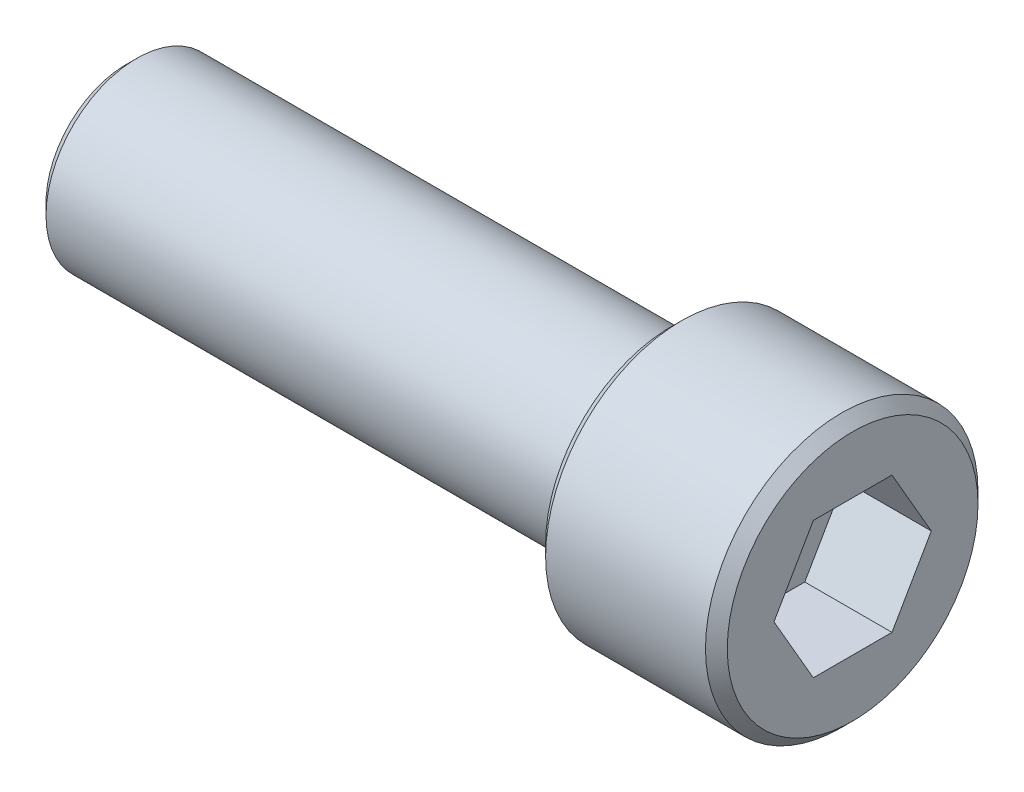
ISO-10303-21;
HEADER;
FILE_DESCRIPTION(('STEP AP214'),'2;1');
FILE_NAME('part.step','',(''),(''),'','','');
FILE_SCHEMA(('AUTOMOTIVE_DESIGN { 1 0 10303 214 1 1 1 1 }'));
ENDSEC;
DATA;
#1=APPLICATION_CONTEXT('core data for automotive mechanical design processes');
#2=APPLICATION_PROTOCOL_DEFINITION('international standard','automotive_design',2000,#1);
#3=PRODUCT_CONTEXT('',#1,'mechanical');
#4=PRODUCT('Part','Part','',(#3));
#5=PRODUCT_RELATED_PRODUCT_CATEGORY('part','',(#4));
#6=PRODUCT_DEFINITION_FORMATION('','',#4);
#7=PRODUCT_DEFINITION_CONTEXT('part definition',#1,'design');
#8=PRODUCT_DEFINITION('design','',#6,#7);
#9=PRODUCT_DEFINITION_SHAPE('','',#8);
#10=(LENGTH_UNIT() NAMED_UNIT(*) SI_UNIT(.MILLI.,.METRE.));
#11=(NAMED_UNIT(*) PLANE_ANGLE_UNIT() SI_UNIT($,.RADIAN.));
#12=(NAMED_UNIT(*) SI_UNIT($,.STERADIAN.) SOLID_ANGLE_UNIT());
#13=UNCERTAINTY_MEASURE_WITH_UNIT(LENGTH_MEASURE(1.E-05),#10,'distance_accuracy_value','');
#14=(GEOMETRIC_REPRESENTATION_CONTEXT(3) GLOBAL_UNCERTAINTY_ASSIGNED_CONTEXT((#13)) GLOBAL_UNIT_ASSIGNED_CONTEXT((#10,
#11,#12)) REPRESENTATION_CONTEXT('',''));
#15=CARTESIAN_POINT('',(0.,0.,0.));
#16=DIRECTION('',(0.,0.,1.));
#17=DIRECTION('',(1.,0.,0.));
#18=AXIS2_PLACEMENT_3D('',#15,#16,#17);
#19=CARTESIAN_POINT('',(0.,3.175,0.));
#20=DIRECTION('',(1.,0.,0.));
#21=DIRECTION('',(0.,0.,-1.));
#22=AXIS2_PLACEMENT_3D('',#19,#20,#21);
#23=PLANE('',#22);
#24=CARTESIAN_POINT('',(0.,0.,0.));
#25=DIRECTION('',(1.,0.,0.));
#26=DIRECTION('',(0.,0.,-1.));
#27=AXIS2_PLACEMENT_3D('',#24,#25,#26);
#28=CIRCLE('',#27,2.794);
#29=CARTESIAN_POINT('',(0.,0.,-2.794));
#30=VERTEX_POINT('',#29);
#31=EDGE_CURVE('E143',#30,#30,#28,.F.);
#32=ORIENTED_EDGE('',*,*,#31,.T.);
#33=EDGE_LOOP('',(#32));
#34=FACE_BOUND('',#33,.T.);
#35=ADVANCED_FACE('F33',(#34),#23,.F.);
#36=CARTESIAN_POINT('',(25.4,0.,0.));
#37=DIRECTION('',(-1.,0.,0.));
#38=DIRECTION('',(0.,0.,1.));
#39=AXIS2_PLACEMENT_3D('',#36,#37,#38);
#40=PLANE('',#39);
#41=CARTESIAN_POINT('',(25.4,0.,0.));
#42=DIRECTION('',(-1.,0.,0.));
#43=DIRECTION('',(0.,0.,1.));
#44=AXIS2_PLACEMENT_3D('',#41,#42,#43);
#45=CIRCLE('',#44,4.3815);
#46=CARTESIAN_POINT('',(25.4,0.,4.3815));
#47=VERTEX_POINT('',#46);
#48=EDGE_CURVE('E11',#47,#47,#45,.F.);
#49=ORIENTED_EDGE('',*,*,#48,.T.);
#50=EDGE_LOOP('',(#49));
#51=FACE_BOUND('',#50,.T.);
#52=DIRECTION('',(0.,-0.866025403784439,0.5));
#53=VECTOR('',#52,1.);
#54=CARTESIAN_POINT('',(25.4,2.38125,1.3748153285078));
#55=LINE('',#54,#53);
#56=CARTESIAN_POINT('',(25.4,2.38125,1.3748153285078));
#57=VERTEX_POINT('',#56);
#58=CARTESIAN_POINT('',(25.4,0.,2.74963065701559));
#59=VERTEX_POINT('',#58);
#60=EDGE_CURVE('E122',#57,#59,#55,.T.);
#61=ORIENTED_EDGE('',*,*,#60,.F.);
#62=DIRECTION('',(0.,0.,1.));
#63=VECTOR('',#62,1.);
#64=CARTESIAN_POINT('',(25.4,2.38125,-1.3748153285078));
#65=LINE('',#64,#63);
#66=CARTESIAN_POINT('',(25.4,2.38125,-1.3748153285078));
#67=VERTEX_POINT('',#66);
#68=EDGE_CURVE('E48',#67,#57,#65,.T.);
#69=ORIENTED_EDGE('',*,*,#68,.F.);
#70=DIRECTION('',(0.,0.866025403784439,0.5));
#71=VECTOR('',#70,1.);
#72=CARTESIAN_POINT('',(25.4,0.,-2.74963065701559));
#73=LINE('',#72,#71);
#74=CARTESIAN_POINT('',(25.4,0.,-2.74963065701559));
#75=VERTEX_POINT('',#74);
#76=EDGE_CURVE('E131',#75,#67,#73,.T.);
#77=ORIENTED_EDGE('',*,*,#76,.F.);
#78=DIRECTION('',(0.,0.866025403784439,-0.5));
#79=VECTOR('',#78,1.);
#80=CARTESIAN_POINT('',(25.4,-2.38125,-1.3748153285078));
#81=LINE('',#80,#79);
#82=CARTESIAN_POINT('',(25.4,-2.38125,-1.3748153285078));
#83=VERTEX_POINT('',#82);
#84=EDGE_CURVE('E129',#83,#75,#81,.T.);
#85=ORIENTED_EDGE('',*,*,#84,.F.);
#86=DIRECTION('',(0.,0.,-1.));
#87=VECTOR('',#86,1.);
#88=CARTESIAN_POINT('',(25.4,-2.38125,1.3748153285078));
#89=LINE('',#88,#87);
#90=CARTESIAN_POINT('',(25.4,-2.38125,1.3748153285078));
#91=VERTEX_POINT('',#90);
#92=EDGE_CURVE('E96',#91,#83,#89,.T.);
#93=ORIENTED_EDGE('',*,*,#92,.F.);
#94=DIRECTION('',(0.,-0.866025403784439,-0.5));
#95=VECTOR('',#94,1.);
#96=CARTESIAN_POINT('',(25.4,0.,2.74963065701559));
#97=LINE('',#96,#95);
#98=EDGE_CURVE('E125',#59,#91,#97,.T.);
#99=ORIENTED_EDGE('',*,*,#98,.F.);
#100=EDGE_LOOP('',(#61,#69,#77,#85,#93,#99));
#101=FACE_BOUND('',#100,.T.);
#102=ADVANCED_FACE('F183',(#51,#101),#40,.F.);
#103=CARTESIAN_POINT('',(0.,0.,0.));
#104=DIRECTION('',(-1.,0.,0.));
#105=DIRECTION('',(0.,0.,1.));
#106=AXIS2_PLACEMENT_3D('',#103,#104,#105);
#107=CYLINDRICAL_SURFACE('',#106,4.7625);
#108=CARTESIAN_POINT('',(19.431,0.,0.));
#109=DIRECTION('',(1.,0.,0.));
#110=DIRECTION('',(0.,0.,-1.));
#111=AXIS2_PLACEMENT_3D('',#108,#109,#110);
#112=CIRCLE('',#111,4.7625);
#113=CARTESIAN_POINT('',(19.431,0.,-4.7625));
#114=VERTEX_POINT('',#113);
#115=EDGE_CURVE('E41',#114,#114,#112,.T.);
#116=ORIENTED_EDGE('',*,*,#115,.T.);
#117=EDGE_LOOP('',(#116));
#118=FACE_BOUND('',#117,.T.);
#119=CARTESIAN_POINT('',(25.019,0.,0.));
#120=DIRECTION('',(-1.,0.,0.));
#121=DIRECTION('',(0.,0.,1.));
#122=AXIS2_PLACEMENT_3D('',#119,#120,#121);
#123=CIRCLE('',#122,4.7625);
#124=CARTESIAN_POINT('',(25.019,0.,4.7625));
#125=VERTEX_POINT('',#124);
#126=EDGE_CURVE('E152',#125,#125,#123,.T.);
#127=ORIENTED_EDGE('',*,*,#126,.T.);
#128=EDGE_LOOP('',(#127));
#129=FACE_BOUND('',#128,.T.);
#130=ADVANCED_FACE('F157',(#118,#129),#107,.T.);
#131=CARTESIAN_POINT('',(19.05,4.7625,0.));
#132=DIRECTION('',(1.,0.,0.));
#133=DIRECTION('',(0.,0.,-1.));
#134=AXIS2_PLACEMENT_3D('',#131,#132,#133);
#135=PLANE('',#134);
#136=CARTESIAN_POINT('',(19.05,0.,0.));
#137=DIRECTION('',(1.,0.,0.));
#138=DIRECTION('',(0.,0.,-1.));
#139=AXIS2_PLACEMENT_3D('',#136,#137,#138);
#140=CIRCLE('',#139,4.3815);
#141=CARTESIAN_POINT('',(19.05,0.,-4.3815));
#142=VERTEX_POINT('',#141);
#143=EDGE_CURVE('E149',#142,#142,#140,.F.);
#144=ORIENTED_EDGE('',*,*,#143,.T.);
#145=EDGE_LOOP('',(#144));
#146=FACE_BOUND('',#145,.T.);
#147=CARTESIAN_POINT('',(19.05,0.,0.));
#148=DIRECTION('',(-1.,0.,0.));
#149=DIRECTION('',(0.,0.,1.));
#150=AXIS2_PLACEMENT_3D('',#147,#148,#149);
#151=CIRCLE('',#150,3.175);
#152=CARTESIAN_POINT('',(19.05,0.,3.175));
#153=VERTEX_POINT('',#152);
#154=EDGE_CURVE('E135',#153,#153,#151,.T.);
#155=ORIENTED_EDGE('',*,*,#154,.F.);
#156=EDGE_LOOP('',(#155));
#157=FACE_BOUND('',#156,.T.);
#158=ADVANCED_FACE('F166',(#146,#157),#135,.F.);
#159=CARTESIAN_POINT('',(0.,0.,0.));
#160=DIRECTION('',(-1.,0.,0.));
#161=DIRECTION('',(0.,0.,1.));
#162=AXIS2_PLACEMENT_3D('',#159,#160,#161);
#163=CYLINDRICAL_SURFACE('',#162,3.175);
#164=CARTESIAN_POINT('',(0.380999999999999,0.,0.));
#165=DIRECTION('',(1.,0.,0.));
#166=DIRECTION('',(0.,0.,-1.));
#167=AXIS2_PLACEMENT_3D('',#164,#165,#166);
#168=CIRCLE('',#167,3.175);
#169=CARTESIAN_POINT('',(0.380999999999999,0.,-3.175));
#170=VERTEX_POINT('',#169);
#171=EDGE_CURVE('E146',#170,#170,#168,.T.);
#172=ORIENTED_EDGE('',*,*,#171,.T.);
#173=EDGE_LOOP('',(#172));
#174=FACE_BOUND('',#173,.T.);
#175=ORIENTED_EDGE('',*,*,#154,.T.);
#176=EDGE_LOOP('',(#175));
#177=FACE_BOUND('',#176,.T.);
#178=ADVANCED_FACE('F169',(#174,#177),#163,.T.);
#179=CARTESIAN_POINT('',(22.352,2.38125,-1.3748153285078));
#180=DIRECTION('',(0.,1.,0.));
#181=DIRECTION('',(0.,0.,1.));
#182=AXIS2_PLACEMENT_3D('',#179,#180,#181);
#183=PLANE('',#182);
#184=ORIENTED_EDGE('',*,*,#68,.T.);
#185=DIRECTION('',(1.,0.,0.));
#186=VECTOR('',#185,1.);
#187=CARTESIAN_POINT('',(22.352,2.38125,1.3748153285078));
#188=LINE('',#187,#186);
#189=CARTESIAN_POINT('',(22.352,2.38125,1.3748153285078));
#190=VERTEX_POINT('',#189);
#191=EDGE_CURVE('E78',#190,#57,#188,.T.);
#192=ORIENTED_EDGE('',*,*,#191,.F.);
#193=DIRECTION('',(0.,0.,1.));
#194=VECTOR('',#193,1.);
#195=CARTESIAN_POINT('',(22.352,2.38125,-1.3748153285078));
#196=LINE('',#195,#194);
#197=CARTESIAN_POINT('',(22.352,2.38125,-1.3748153285078));
#198=VERTEX_POINT('',#197);
#199=EDGE_CURVE('E133',#198,#190,#196,.T.);
#200=ORIENTED_EDGE('',*,*,#199,.F.);
#201=DIRECTION('',(1.,0.,0.));
#202=VECTOR('',#201,1.);
#203=CARTESIAN_POINT('',(22.352,2.38125,-1.3748153285078));
#204=LINE('',#203,#202);
#205=EDGE_CURVE('E56',#198,#67,#204,.T.);
#206=ORIENTED_EDGE('',*,*,#205,.T.);
#207=EDGE_LOOP('',(#184,#192,#200,#206));
#208=FACE_BOUND('',#207,.T.);
#209=ADVANCED_FACE('F174',(#208),#183,.F.);
#210=CARTESIAN_POINT('',(22.352,0.,-2.74963065701559));
#211=DIRECTION('',(0.,0.5,-0.866025403784439));
#212=DIRECTION('',(0.,0.866025403784439,0.5));
#213=AXIS2_PLACEMENT_3D('',#210,#211,#212);
#214=PLANE('',#213);
#215=ORIENTED_EDGE('',*,*,#76,.T.);
#216=ORIENTED_EDGE('',*,*,#205,.F.);
#217=DIRECTION('',(0.,0.866025403784439,0.5));
#218=VECTOR('',#217,1.);
#219=CARTESIAN_POINT('',(22.352,0.,-2.74963065701559));
#220=LINE('',#219,#218);
#221=CARTESIAN_POINT('',(22.352,0.,-2.74963065701559));
#222=VERTEX_POINT('',#221);
#223=EDGE_CURVE('E108',#222,#198,#220,.T.);
#224=ORIENTED_EDGE('',*,*,#223,.F.);
#225=DIRECTION('',(1.,0.,0.));
#226=VECTOR('',#225,1.);
#227=CARTESIAN_POINT('',(22.352,0.,-2.74963065701559));
#228=LINE('',#227,#226);
#229=EDGE_CURVE('E100',#222,#75,#228,.T.);
#230=ORIENTED_EDGE('',*,*,#229,.T.);
#231=EDGE_LOOP('',(#215,#216,#224,#230));
#232=FACE_BOUND('',#231,.T.);
#233=ADVANCED_FACE('F180',(#232),#214,.F.);
#234=CARTESIAN_POINT('',(22.352,-2.38125,-1.3748153285078));
#235=DIRECTION('',(0.,-0.5,-0.866025403784439));
#236=DIRECTION('',(0.,0.866025403784439,-0.5));
#237=AXIS2_PLACEMENT_3D('',#234,#235,#236);
#238=PLANE('',#237);
#239=ORIENTED_EDGE('',*,*,#84,.T.);
#240=ORIENTED_EDGE('',*,*,#229,.F.);
#241=DIRECTION('',(0.,0.866025403784439,-0.5));
#242=VECTOR('',#241,1.);
#243=CARTESIAN_POINT('',(22.352,-2.38125,-1.3748153285078));
#244=LINE('',#243,#242);
#245=CARTESIAN_POINT('',(22.352,-2.38125,-1.3748153285078));
#246=VERTEX_POINT('',#245);
#247=EDGE_CURVE('E104',#246,#222,#244,.T.);
#248=ORIENTED_EDGE('',*,*,#247,.F.);
#249=DIRECTION('',(1.,0.,0.));
#250=VECTOR('',#249,1.);
#251=CARTESIAN_POINT('',(22.352,-2.38125,-1.3748153285078));
#252=LINE('',#251,#250);
#253=EDGE_CURVE('E89',#246,#83,#252,.T.);
#254=ORIENTED_EDGE('',*,*,#253,.T.);
#255=EDGE_LOOP('',(#239,#240,#248,#254));
#256=FACE_BOUND('',#255,.T.);
#257=ADVANCED_FACE('F105',(#256),#238,.F.);
#258=CARTESIAN_POINT('',(22.352,-2.38125,1.3748153285078));
#259=DIRECTION('',(0.,-1.,0.));
#260=DIRECTION('',(0.,0.,-1.));
#261=AXIS2_PLACEMENT_3D('',#258,#259,#260);
#262=PLANE('',#261);
#263=ORIENTED_EDGE('',*,*,#92,.T.);
#264=ORIENTED_EDGE('',*,*,#253,.F.);
#265=DIRECTION('',(0.,0.,-1.));
#266=VECTOR('',#265,1.);
#267=CARTESIAN_POINT('',(22.352,-2.38125,1.3748153285078));
#268=LINE('',#267,#266);
#269=CARTESIAN_POINT('',(22.352,-2.38125,1.3748153285078));
#270=VERTEX_POINT('',#269);
#271=EDGE_CURVE('E93',#270,#246,#268,.T.);
#272=ORIENTED_EDGE('',*,*,#271,.F.);
#273=DIRECTION('',(1.,0.,0.));
#274=VECTOR('',#273,1.);
#275=CARTESIAN_POINT('',(22.352,-2.38125,1.3748153285078));
#276=LINE('',#275,#274);
#277=EDGE_CURVE('E101',#270,#91,#276,.T.);
#278=ORIENTED_EDGE('',*,*,#277,.T.);
#279=EDGE_LOOP('',(#263,#264,#272,#278));
#280=FACE_BOUND('',#279,.T.);
#281=ADVANCED_FACE('F91',(#280),#262,.F.);
#282=CARTESIAN_POINT('',(22.352,0.,2.74963065701559));
#283=DIRECTION('',(0.,-0.5,0.866025403784439));
#284=DIRECTION('',(0.,-0.866025403784439,-0.5));
#285=AXIS2_PLACEMENT_3D('',#282,#283,#284);
#286=PLANE('',#285);
#287=ORIENTED_EDGE('',*,*,#98,.T.);
#288=ORIENTED_EDGE('',*,*,#277,.F.);
#289=DIRECTION('',(0.,-0.866025403784439,-0.5));
#290=VECTOR('',#289,1.);
#291=CARTESIAN_POINT('',(22.352,0.,2.74963065701559));
#292=LINE('',#291,#290);
#293=CARTESIAN_POINT('',(22.352,0.,2.74963065701559));
#294=VERTEX_POINT('',#293);
#295=EDGE_CURVE('E114',#294,#270,#292,.T.);
#296=ORIENTED_EDGE('',*,*,#295,.F.);
#297=DIRECTION('',(1.,0.,0.));
#298=VECTOR('',#297,1.);
#299=CARTESIAN_POINT('',(22.352,0.,2.74963065701559));
#300=LINE('',#299,#298);
#301=EDGE_CURVE('E138',#294,#59,#300,.T.);
#302=ORIENTED_EDGE('',*,*,#301,.T.);
#303=EDGE_LOOP('',(#287,#288,#296,#302));
#304=FACE_BOUND('',#303,.T.);
#305=ADVANCED_FACE('F206',(#304),#286,.F.);
#306=CARTESIAN_POINT('',(22.352,2.38125,1.3748153285078));
#307=DIRECTION('',(0.,0.5,0.866025403784439));
#308=DIRECTION('',(0.,-0.866025403784439,0.5));
#309=AXIS2_PLACEMENT_3D('',#306,#307,#308);
#310=PLANE('',#309);
#311=ORIENTED_EDGE('',*,*,#60,.T.);
#312=ORIENTED_EDGE('',*,*,#301,.F.);
#313=DIRECTION('',(0.,-0.866025403784439,0.5));
#314=VECTOR('',#313,1.);
#315=CARTESIAN_POINT('',(22.352,2.38125,1.3748153285078));
#316=LINE('',#315,#314);
#317=EDGE_CURVE('E116',#190,#294,#316,.T.);
#318=ORIENTED_EDGE('',*,*,#317,.F.);
#319=ORIENTED_EDGE('',*,*,#191,.T.);
#320=EDGE_LOOP('',(#311,#312,#318,#319));
#321=FACE_BOUND('',#320,.T.);
#322=ADVANCED_FACE('F198',(#321),#310,.F.);
#323=CARTESIAN_POINT('',(22.352,0.,0.));
#324=DIRECTION('',(1.,0.,0.));
#325=DIRECTION('',(0.,0.,-1.));
#326=AXIS2_PLACEMENT_3D('',#323,#324,#325);
#327=PLANE('',#326);
#328=ORIENTED_EDGE('',*,*,#199,.T.);
#329=ORIENTED_EDGE('',*,*,#317,.T.);
#330=ORIENTED_EDGE('',*,*,#295,.T.);
#331=ORIENTED_EDGE('',*,*,#271,.T.);
#332=ORIENTED_EDGE('',*,*,#247,.T.);
#333=ORIENTED_EDGE('',*,*,#223,.T.);
#334=EDGE_LOOP('',(#328,#329,#330,#331,#332,#333));
#335=FACE_BOUND('',#334,.T.);
#336=ADVANCED_FACE('F111',(#335),#327,.T.);
#337=CARTESIAN_POINT('',(0.,0.,0.));
#338=DIRECTION('',(1.,0.,0.));
#339=DIRECTION('',(0.,0.,-1.));
#340=AXIS2_PLACEMENT_3D('',#337,#338,#339);
#341=CONICAL_SURFACE('',#340,2.794,0.785398163397448);
#342=ORIENTED_EDGE('',*,*,#171,.F.);
#343=EDGE_LOOP('',(#342));
#344=FACE_BOUND('',#343,.T.);
#345=ORIENTED_EDGE('',*,*,#31,.F.);
#346=EDGE_LOOP('',(#345));
#347=FACE_BOUND('',#346,.T.);
#348=ADVANCED_FACE('F163',(#344,#347),#341,.T.);
#349=CARTESIAN_POINT('',(19.05,0.,0.));
#350=DIRECTION('',(1.,0.,0.));
#351=DIRECTION('',(0.,0.,-1.));
#352=AXIS2_PLACEMENT_3D('',#349,#350,#351);
#353=CONICAL_SURFACE('',#352,4.3815,0.785398163397446);
#354=ORIENTED_EDGE('',*,*,#115,.F.);
#355=EDGE_LOOP('',(#354));
#356=FACE_BOUND('',#355,.T.);
#357=ORIENTED_EDGE('',*,*,#143,.F.);
#358=EDGE_LOOP('',(#357));
#359=FACE_BOUND('',#358,.T.);
#360=ADVANCED_FACE('F160',(#356,#359),#353,.T.);
#361=CARTESIAN_POINT('',(25.019,0.,0.));
#362=DIRECTION('',(-1.,0.,0.));
#363=DIRECTION('',(0.,0.,1.));
#364=AXIS2_PLACEMENT_3D('',#361,#362,#363);
#365=CONICAL_SURFACE('',#364,4.7625,0.785398163397446);
#366=ORIENTED_EDGE('',*,*,#48,.F.);
#367=EDGE_LOOP('',(#366));
#368=FACE_BOUND('',#367,.T.);
#369=ORIENTED_EDGE('',*,*,#126,.F.);
#370=EDGE_LOOP('',(#369));
#371=FACE_BOUND('',#370,.T.);
#372=ADVANCED_FACE('F35',(#368,#371),#365,.T.);
#373=CLOSED_SHELL('',(#35,#102,#130,#158,#178,#209,#233,#257,#281,#305,#322,#336,#348,#360,#372));
#374=MANIFOLD_SOLID_BREP('B2',#373);
#375=ADVANCED_BREP_SHAPE_REPRESENTATION('',(#18,#374),#14);
#376=SHAPE_DEFINITION_REPRESENTATION(#9,#375);
ENDSEC;
END-ISO-10303-21;
